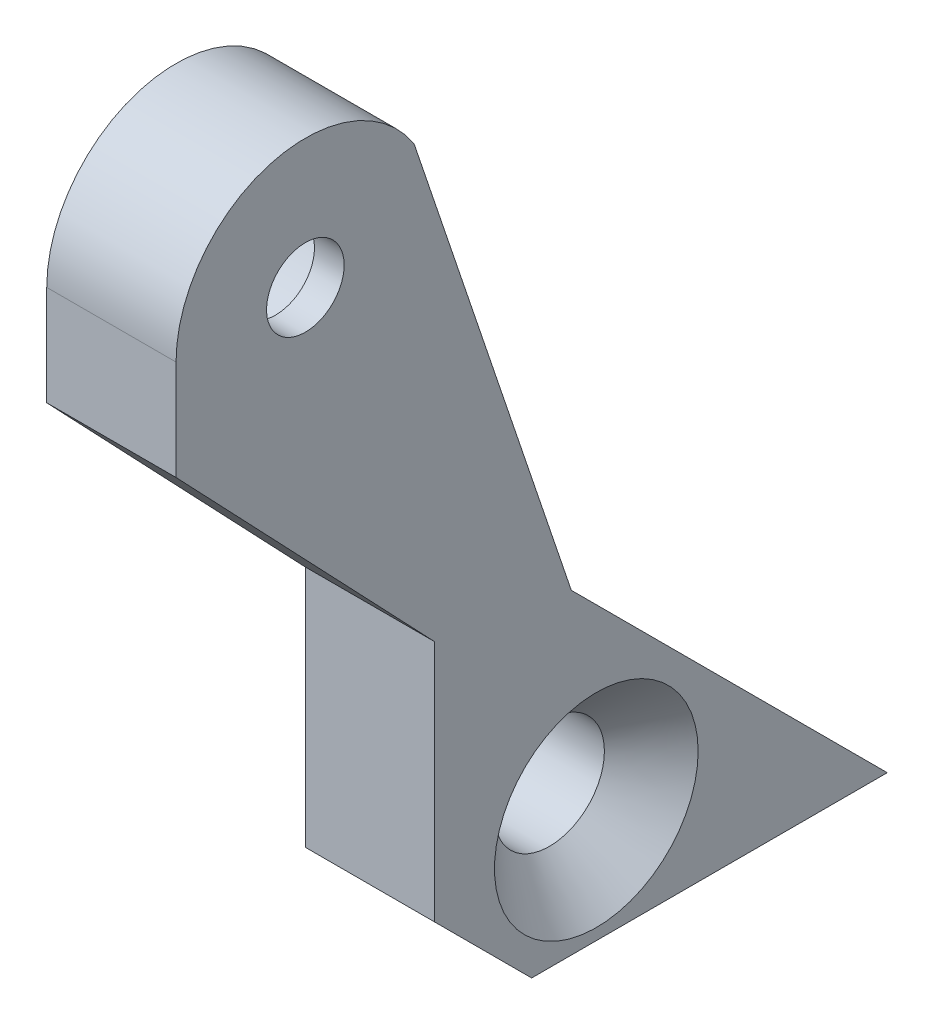
ISO-10303-21;
HEADER;
FILE_DESCRIPTION(('STEP AP214'),'2;1');
FILE_NAME('part.step','',(''),(''),'','','');
FILE_SCHEMA(('AUTOMOTIVE_DESIGN { 1 0 10303 214 1 1 1 1 }'));
ENDSEC;
DATA;
#1=APPLICATION_CONTEXT('core data for automotive mechanical design processes');
#2=APPLICATION_PROTOCOL_DEFINITION('international standard','automotive_design',2000,#1);
#3=PRODUCT_CONTEXT('',#1,'mechanical');
#4=PRODUCT('Part','Part','',(#3));
#5=PRODUCT_RELATED_PRODUCT_CATEGORY('part','',(#4));
#6=PRODUCT_DEFINITION_FORMATION('','',#4);
#7=PRODUCT_DEFINITION_CONTEXT('part definition',#1,'design');
#8=PRODUCT_DEFINITION('design','',#6,#7);
#9=PRODUCT_DEFINITION_SHAPE('','',#8);
#10=(LENGTH_UNIT() NAMED_UNIT(*) SI_UNIT(.MILLI.,.METRE.));
#11=(NAMED_UNIT(*) PLANE_ANGLE_UNIT() SI_UNIT($,.RADIAN.));
#12=(NAMED_UNIT(*) SI_UNIT($,.STERADIAN.) SOLID_ANGLE_UNIT());
#13=UNCERTAINTY_MEASURE_WITH_UNIT(LENGTH_MEASURE(1.E-05),#10,'distance_accuracy_value','');
#14=(GEOMETRIC_REPRESENTATION_CONTEXT(3) GLOBAL_UNCERTAINTY_ASSIGNED_CONTEXT((#13)) GLOBAL_UNIT_ASSIGNED_CONTEXT((#10,
#11,#12)) REPRESENTATION_CONTEXT('',''));
#15=CARTESIAN_POINT('',(0.,0.,0.));
#16=DIRECTION('',(0.,0.,1.));
#17=DIRECTION('',(1.,0.,0.));
#18=AXIS2_PLACEMENT_3D('',#15,#16,#17);
#19=CARTESIAN_POINT('',(4.,0.,0.));
#20=DIRECTION('',(0.,0.689683794027428,-0.724110671276106));
#21=DIRECTION('',(0.,0.724110671276106,0.689683794027428));
#22=AXIS2_PLACEMENT_3D('',#19,#20,#21);
#23=PLANE('',#22);
#24=DIRECTION('',(0.,-0.724110671276106,-0.689683794027428));
#25=VECTOR('',#24,1.);
#26=CARTESIAN_POINT('',(0.,0.,0.));
#27=LINE('',#26,#25);
#28=CARTESIAN_POINT('',(0.,0.,0.));
#29=VERTEX_POINT('',#28);
#30=CARTESIAN_POINT('',(0.,-8.39933520313872,-8.));
#31=VERTEX_POINT('',#30);
#32=EDGE_CURVE('E134',#29,#31,#27,.T.);
#33=ORIENTED_EDGE('',*,*,#32,.T.);
#34=DIRECTION('',(-1.,0.,0.));
#35=VECTOR('',#34,1.);
#36=CARTESIAN_POINT('',(4.,-8.39933520313872,-8.));
#37=LINE('',#36,#35);
#38=CARTESIAN_POINT('',(4.,-8.39933520313872,-8.));
#39=VERTEX_POINT('',#38);
#40=EDGE_CURVE('E11',#39,#31,#37,.T.);
#41=ORIENTED_EDGE('',*,*,#40,.F.);
#42=DIRECTION('',(0.,-0.724110671276106,-0.689683794027428));
#43=VECTOR('',#42,1.);
#44=CARTESIAN_POINT('',(4.,0.,0.));
#45=LINE('',#44,#43);
#46=CARTESIAN_POINT('',(4.,0.,0.));
#47=VERTEX_POINT('',#46);
#48=EDGE_CURVE('E149',#47,#39,#45,.T.);
#49=ORIENTED_EDGE('',*,*,#48,.F.);
#50=DIRECTION('',(-1.,0.,0.));
#51=VECTOR('',#50,1.);
#52=CARTESIAN_POINT('',(4.,0.,0.));
#53=LINE('',#52,#51);
#54=EDGE_CURVE('E130',#47,#29,#53,.T.);
#55=ORIENTED_EDGE('',*,*,#54,.T.);
#56=EDGE_LOOP('',(#33,#41,#49,#55));
#57=FACE_BOUND('',#56,.T.);
#58=ADVANCED_FACE('F37',(#57),#23,.F.);
#59=CARTESIAN_POINT('',(4.,-8.39933520313872,-8.));
#60=DIRECTION('',(0.,0.,-1.));
#61=DIRECTION('',(-1.,0.,0.));
#62=AXIS2_PLACEMENT_3D('',#59,#60,#61);
#63=PLANE('',#62);
#64=DIRECTION('',(0.,-1.,0.));
#65=VECTOR('',#64,1.);
#66=CARTESIAN_POINT('',(0.,-8.39933520313872,-8.));
#67=LINE('',#66,#65);
#68=CARTESIAN_POINT('',(0.,-15.9081605006336,-8.));
#69=VERTEX_POINT('',#68);
#70=EDGE_CURVE('E137',#31,#69,#67,.T.);
#71=ORIENTED_EDGE('',*,*,#70,.T.);
#72=DIRECTION('',(-1.,0.,0.));
#73=VECTOR('',#72,1.);
#74=CARTESIAN_POINT('',(4.,-15.9081605006336,-8.));
#75=LINE('',#74,#73);
#76=CARTESIAN_POINT('',(4.,-15.9081605006336,-8.));
#77=VERTEX_POINT('',#76);
#78=EDGE_CURVE('E46',#77,#69,#75,.T.);
#79=ORIENTED_EDGE('',*,*,#78,.F.);
#80=DIRECTION('',(0.,-1.,0.));
#81=VECTOR('',#80,1.);
#82=CARTESIAN_POINT('',(4.,-8.39933520313872,-8.));
#83=LINE('',#82,#81);
#84=EDGE_CURVE('E97',#39,#77,#83,.T.);
#85=ORIENTED_EDGE('',*,*,#84,.F.);
#86=ORIENTED_EDGE('',*,*,#40,.T.);
#87=EDGE_LOOP('',(#71,#79,#85,#86));
#88=FACE_BOUND('',#87,.T.);
#89=ADVANCED_FACE('F236',(#88),#63,.F.);
#90=CARTESIAN_POINT('',(4.,-15.9081605006336,-8.));
#91=DIRECTION('',(0.,0.707106781186547,-0.707106781186547));
#92=DIRECTION('',(0.,0.707106781186548,0.707106781186548));
#93=AXIS2_PLACEMENT_3D('',#90,#91,#92);
#94=PLANE('',#93);
#95=DIRECTION('',(0.,-0.707106781186548,-0.707106781186548));
#96=VECTOR('',#95,1.);
#97=CARTESIAN_POINT('',(0.,-15.9081605006336,-8.));
#98=LINE('',#97,#96);
#99=CARTESIAN_POINT('',(0.,-18.9081605006336,-11.));
#100=VERTEX_POINT('',#99);
#101=EDGE_CURVE('E140',#69,#100,#98,.T.);
#102=ORIENTED_EDGE('',*,*,#101,.T.);
#103=DIRECTION('',(-1.,0.,0.));
#104=VECTOR('',#103,1.);
#105=CARTESIAN_POINT('',(4.,-18.9081605006336,-11.));
#106=LINE('',#105,#104);
#107=CARTESIAN_POINT('',(4.,-18.9081605006336,-11.));
#108=VERTEX_POINT('',#107);
#109=EDGE_CURVE('E156',#108,#100,#106,.T.);
#110=ORIENTED_EDGE('',*,*,#109,.F.);
#111=DIRECTION('',(0.,-0.707106781186548,-0.707106781186548));
#112=VECTOR('',#111,1.);
#113=CARTESIAN_POINT('',(4.,-15.9081605006336,-8.));
#114=LINE('',#113,#112);
#115=EDGE_CURVE('E165',#77,#108,#114,.T.);
#116=ORIENTED_EDGE('',*,*,#115,.F.);
#117=ORIENTED_EDGE('',*,*,#78,.T.);
#118=EDGE_LOOP('',(#102,#110,#116,#117));
#119=FACE_BOUND('',#118,.T.);
#120=ADVANCED_FACE('F163',(#119),#94,.F.);
#121=CARTESIAN_POINT('',(4.,-18.9081605006336,-11.));
#122=DIRECTION('',(0.,1.,0.));
#123=DIRECTION('',(0.,0.,1.));
#124=AXIS2_PLACEMENT_3D('',#121,#122,#123);
#125=PLANE('',#124);
#126=DIRECTION('',(0.,0.,-1.));
#127=VECTOR('',#126,1.);
#128=CARTESIAN_POINT('',(0.,-18.9081605006336,-11.));
#129=LINE('',#128,#127);
#130=CARTESIAN_POINT('',(0.,-18.9081605006336,-22.));
#131=VERTEX_POINT('',#130);
#132=EDGE_CURVE('E142',#100,#131,#129,.T.);
#133=ORIENTED_EDGE('',*,*,#132,.T.);
#134=DIRECTION('',(-1.,0.,0.));
#135=VECTOR('',#134,1.);
#136=CARTESIAN_POINT('',(4.,-18.9081605006336,-22.));
#137=LINE('',#136,#135);
#138=CARTESIAN_POINT('',(4.,-18.9081605006336,-22.));
#139=VERTEX_POINT('',#138);
#140=EDGE_CURVE('E153',#139,#131,#137,.T.);
#141=ORIENTED_EDGE('',*,*,#140,.F.);
#142=DIRECTION('',(0.,0.,-1.));
#143=VECTOR('',#142,1.);
#144=CARTESIAN_POINT('',(4.,-18.9081605006336,-11.));
#145=LINE('',#144,#143);
#146=EDGE_CURVE('E177',#108,#139,#145,.T.);
#147=ORIENTED_EDGE('',*,*,#146,.F.);
#148=ORIENTED_EDGE('',*,*,#109,.T.);
#149=EDGE_LOOP('',(#133,#141,#147,#148));
#150=FACE_BOUND('',#149,.T.);
#151=ADVANCED_FACE('F173',(#150),#125,.F.);
#152=CARTESIAN_POINT('',(4.,-18.9081605006336,-22.));
#153=DIRECTION('',(0.,-0.707106781186543,0.707106781186552));
#154=DIRECTION('',(0.,-0.707106781186552,-0.707106781186543));
#155=AXIS2_PLACEMENT_3D('',#152,#153,#154);
#156=PLANE('',#155);
#157=DIRECTION('',(0.,0.707106781186552,0.707106781186543));
#158=VECTOR('',#157,1.);
#159=CARTESIAN_POINT('',(0.,-18.9081605006336,-22.));
#160=LINE('',#159,#158);
#161=CARTESIAN_POINT('',(0.,-9.1341449956632,-12.2259844950297));
#162=VERTEX_POINT('',#161);
#163=EDGE_CURVE('E144',#131,#162,#160,.T.);
#164=ORIENTED_EDGE('',*,*,#163,.T.);
#165=DIRECTION('',(-1.,0.,0.));
#166=VECTOR('',#165,1.);
#167=CARTESIAN_POINT('',(4.,-9.1341449956632,-12.2259844950297));
#168=LINE('',#167,#166);
#169=CARTESIAN_POINT('',(4.,-9.1341449956632,-12.2259844950297));
#170=VERTEX_POINT('',#169);
#171=EDGE_CURVE('E125',#170,#162,#168,.T.);
#172=ORIENTED_EDGE('',*,*,#171,.F.);
#173=DIRECTION('',(0.,0.707106781186552,0.707106781186543));
#174=VECTOR('',#173,1.);
#175=CARTESIAN_POINT('',(4.,-18.9081605006336,-22.));
#176=LINE('',#175,#174);
#177=EDGE_CURVE('E116',#139,#170,#176,.T.);
#178=ORIENTED_EDGE('',*,*,#177,.F.);
#179=ORIENTED_EDGE('',*,*,#140,.T.);
#180=EDGE_LOOP('',(#164,#172,#178,#179));
#181=FACE_BOUND('',#180,.T.);
#182=ADVANCED_FACE('F176',(#181),#156,.F.);
#183=CARTESIAN_POINT('',(4.,5.25913739827213,-7.36196665917416));
#184=DIRECTION('',(0.,-0.320149998227886,0.947366865915567));
#185=DIRECTION('',(0.,-0.947366865915567,-0.320149998227886));
#186=AXIS2_PLACEMENT_3D('',#183,#184,#185);
#187=PLANE('',#186);
#188=DIRECTION('',(0.,0.947366865915567,0.320149998227886));
#189=VECTOR('',#188,1.);
#190=CARTESIAN_POINT('',(0.,5.25913739827213,-7.36196665917416));
#191=LINE('',#190,#189);
#192=CARTESIAN_POINT('',(0.,5.25913739827213,-7.36196665917416));
#193=VERTEX_POINT('',#192);
#194=EDGE_CURVE('E124',#162,#193,#191,.T.);
#195=ORIENTED_EDGE('',*,*,#194,.T.);
#196=DIRECTION('',(-1.,0.,0.));
#197=VECTOR('',#196,1.);
#198=CARTESIAN_POINT('',(4.,5.25913739827213,-7.36196665917416));
#199=LINE('',#198,#197);
#200=CARTESIAN_POINT('',(4.,5.25913739827213,-7.36196665917416));
#201=VERTEX_POINT('',#200);
#202=EDGE_CURVE('E121',#201,#193,#199,.T.);
#203=ORIENTED_EDGE('',*,*,#202,.F.);
#204=DIRECTION('',(0.,0.947366865915567,0.320149998227886));
#205=VECTOR('',#204,1.);
#206=CARTESIAN_POINT('',(4.,5.25913739827213,-7.36196665917416));
#207=LINE('',#206,#205);
#208=EDGE_CURVE('E110',#170,#201,#207,.T.);
#209=ORIENTED_EDGE('',*,*,#208,.F.);
#210=ORIENTED_EDGE('',*,*,#171,.T.);
#211=EDGE_LOOP('',(#195,#203,#209,#210));
#212=FACE_BOUND('',#211,.T.);
#213=ADVANCED_FACE('F122',(#212),#187,.F.);
#214=CARTESIAN_POINT('',(4.,3.09183949936636,-4.));
#215=DIRECTION('',(-1.,0.,0.));
#216=DIRECTION('',(0.,0.,1.));
#217=AXIS2_PLACEMENT_3D('',#214,#215,#216);
#218=CYLINDRICAL_SURFACE('',#217,4.);
#219=CARTESIAN_POINT('',(0.,3.09183949936636,-4.));
#220=DIRECTION('',(1.,0.,0.));
#221=DIRECTION('',(0.,0.,1.));
#222=AXIS2_PLACEMENT_3D('',#219,#220,#221);
#223=CIRCLE('',#222,4.);
#224=CARTESIAN_POINT('',(0.,3.09183949936636,0.));
#225=VERTEX_POINT('',#224);
#226=EDGE_CURVE('E83',#193,#225,#223,.T.);
#227=ORIENTED_EDGE('',*,*,#226,.T.);
#228=DIRECTION('',(-1.,0.,0.));
#229=VECTOR('',#228,1.);
#230=CARTESIAN_POINT('',(4.,3.09183949936636,0.));
#231=LINE('',#230,#229);
#232=CARTESIAN_POINT('',(4.,3.09183949936636,0.));
#233=VERTEX_POINT('',#232);
#234=EDGE_CURVE('E126',#233,#225,#231,.T.);
#235=ORIENTED_EDGE('',*,*,#234,.F.);
#236=CARTESIAN_POINT('',(4.,3.09183949936636,-4.));
#237=DIRECTION('',(1.,0.,0.));
#238=DIRECTION('',(0.,0.,1.));
#239=AXIS2_PLACEMENT_3D('',#236,#237,#238);
#240=CIRCLE('',#239,4.);
#241=EDGE_CURVE('E114',#201,#233,#240,.T.);
#242=ORIENTED_EDGE('',*,*,#241,.F.);
#243=ORIENTED_EDGE('',*,*,#202,.T.);
#244=EDGE_LOOP('',(#227,#235,#242,#243));
#245=FACE_BOUND('',#244,.T.);
#246=ADVANCED_FACE('F128',(#245),#218,.T.);
#247=CARTESIAN_POINT('',(4.,0.,0.));
#248=DIRECTION('',(0.,0.,-1.));
#249=DIRECTION('',(-1.,0.,0.));
#250=AXIS2_PLACEMENT_3D('',#247,#248,#249);
#251=PLANE('',#250);
#252=DIRECTION('',(0.,-1.,0.));
#253=VECTOR('',#252,1.);
#254=CARTESIAN_POINT('',(0.,0.,0.));
#255=LINE('',#254,#253);
#256=EDGE_CURVE('E89',#225,#29,#255,.T.);
#257=ORIENTED_EDGE('',*,*,#256,.T.);
#258=ORIENTED_EDGE('',*,*,#54,.F.);
#259=DIRECTION('',(0.,-1.,0.));
#260=VECTOR('',#259,1.);
#261=CARTESIAN_POINT('',(4.,0.,0.));
#262=LINE('',#261,#260);
#263=EDGE_CURVE('E54',#233,#47,#262,.T.);
#264=ORIENTED_EDGE('',*,*,#263,.F.);
#265=ORIENTED_EDGE('',*,*,#234,.T.);
#266=EDGE_LOOP('',(#257,#258,#264,#265));
#267=FACE_BOUND('',#266,.T.);
#268=ADVANCED_FACE('F205',(#267),#251,.F.);
#269=CARTESIAN_POINT('',(4.,3.09183949936636,-4.));
#270=DIRECTION('',(-1.,0.,0.));
#271=DIRECTION('',(0.,0.,1.));
#272=AXIS2_PLACEMENT_3D('',#269,#270,#271);
#273=PLANE('',#272);
#274=CARTESIAN_POINT('',(4.,-15.4081605006336,-13.));
#275=DIRECTION('',(1.,0.,0.));
#276=DIRECTION('',(0.,0.,-1.));
#277=AXIS2_PLACEMENT_3D('',#274,#275,#276);
#278=CIRCLE('',#277,3.15);
#279=CARTESIAN_POINT('',(4.,-15.4081605006336,-16.15));
#280=VERTEX_POINT('',#279);
#281=EDGE_CURVE('E197',#280,#280,#278,.T.);
#282=ORIENTED_EDGE('',*,*,#281,.F.);
#283=EDGE_LOOP('',(#282));
#284=FACE_BOUND('',#283,.T.);
#285=CARTESIAN_POINT('',(4.,3.09183949936636,-4.));
#286=DIRECTION('',(1.,0.,0.));
#287=DIRECTION('',(0.,0.,-1.));
#288=AXIS2_PLACEMENT_3D('',#285,#286,#287);
#289=CIRCLE('',#288,1.2);
#290=CARTESIAN_POINT('',(4.,3.09183949936636,-5.2));
#291=VERTEX_POINT('',#290);
#292=EDGE_CURVE('E188',#291,#291,#289,.T.);
#293=ORIENTED_EDGE('',*,*,#292,.F.);
#294=EDGE_LOOP('',(#293));
#295=FACE_BOUND('',#294,.T.);
#296=ORIENTED_EDGE('',*,*,#48,.T.);
#297=ORIENTED_EDGE('',*,*,#84,.T.);
#298=ORIENTED_EDGE('',*,*,#115,.T.);
#299=ORIENTED_EDGE('',*,*,#146,.T.);
#300=ORIENTED_EDGE('',*,*,#177,.T.);
#301=ORIENTED_EDGE('',*,*,#208,.T.);
#302=ORIENTED_EDGE('',*,*,#241,.T.);
#303=ORIENTED_EDGE('',*,*,#263,.T.);
#304=EDGE_LOOP('',(#296,#297,#298,#299,#300,#301,#302,#303));
#305=FACE_BOUND('',#304,.T.);
#306=ADVANCED_FACE('F112',(#284,#295,#305),#273,.F.);
#307=CARTESIAN_POINT('',(0.,3.09183949936636,-4.));
#308=DIRECTION('',(-1.,0.,0.));
#309=DIRECTION('',(0.,0.,1.));
#310=AXIS2_PLACEMENT_3D('',#307,#308,#309);
#311=PLANE('',#310);
#312=CARTESIAN_POINT('',(0.,-15.4081605006336,-13.));
#313=DIRECTION('',(1.,0.,0.));
#314=DIRECTION('',(0.,0.,-1.));
#315=AXIS2_PLACEMENT_3D('',#312,#313,#314);
#316=CIRCLE('',#315,1.7);
#317=CARTESIAN_POINT('',(0.,-15.4081605006336,-14.7));
#318=VERTEX_POINT('',#317);
#319=EDGE_CURVE('E191',#318,#318,#316,.T.);
#320=ORIENTED_EDGE('',*,*,#319,.T.);
#321=EDGE_LOOP('',(#320));
#322=FACE_BOUND('',#321,.T.);
#323=CARTESIAN_POINT('',(0.,3.09183949936636,-4.));
#324=DIRECTION('',(-1.,0.,0.));
#325=DIRECTION('',(0.,0.,1.));
#326=AXIS2_PLACEMENT_3D('',#323,#324,#325);
#327=CIRCLE('',#326,2.99999999999999);
#328=CARTESIAN_POINT('',(0.,3.09183949936636,-1.00000000000001));
#329=VERTEX_POINT('',#328);
#330=EDGE_CURVE('E185',#329,#329,#327,.T.);
#331=ORIENTED_EDGE('',*,*,#330,.F.);
#332=EDGE_LOOP('',(#331));
#333=FACE_BOUND('',#332,.T.);
#334=ORIENTED_EDGE('',*,*,#32,.F.);
#335=ORIENTED_EDGE('',*,*,#256,.F.);
#336=ORIENTED_EDGE('',*,*,#226,.F.);
#337=ORIENTED_EDGE('',*,*,#194,.F.);
#338=ORIENTED_EDGE('',*,*,#163,.F.);
#339=ORIENTED_EDGE('',*,*,#132,.F.);
#340=ORIENTED_EDGE('',*,*,#101,.F.);
#341=ORIENTED_EDGE('',*,*,#70,.F.);
#342=EDGE_LOOP('',(#334,#335,#336,#337,#338,#339,#340,#341));
#343=FACE_BOUND('',#342,.T.);
#344=ADVANCED_FACE('F169',(#322,#333,#343),#311,.T.);
#345=CARTESIAN_POINT('',(2.,3.09183949936636,-4.));
#346=DIRECTION('',(-1.,0.,0.));
#347=DIRECTION('',(0.,0.,1.));
#348=AXIS2_PLACEMENT_3D('',#345,#346,#347);
#349=CONICAL_SURFACE('',#348,2.99999999999999,1.02974425867665);
#350=CARTESIAN_POINT('',(3.08154911424961,3.09183949936636,-4.));
#351=DIRECTION('',(-1.,0.,0.));
#352=DIRECTION('',(0.,0.,1.));
#353=AXIS2_PLACEMENT_3D('',#350,#351,#352);
#354=CIRCLE('',#353,1.2);
#355=CARTESIAN_POINT('',(3.08154911424961,3.09183949936636,-2.8));
#356=VERTEX_POINT('',#355);
#357=EDGE_CURVE('E40',#356,#356,#354,.F.);
#358=ORIENTED_EDGE('',*,*,#357,.T.);
#359=EDGE_LOOP('',(#358));
#360=FACE_BOUND('',#359,.T.);
#361=CARTESIAN_POINT('',(2.,3.09183949936636,-4.));
#362=DIRECTION('',(-1.,0.,0.));
#363=DIRECTION('',(0.,0.,1.));
#364=AXIS2_PLACEMENT_3D('',#361,#362,#363);
#365=CIRCLE('',#364,2.99999999999999);
#366=CARTESIAN_POINT('',(2.,3.09183949936636,-1.00000000000001));
#367=VERTEX_POINT('',#366);
#368=EDGE_CURVE('E138',#367,#367,#365,.T.);
#369=ORIENTED_EDGE('',*,*,#368,.T.);
#370=EDGE_LOOP('',(#369));
#371=FACE_BOUND('',#370,.T.);
#372=ADVANCED_FACE('F218',(#360,#371),#349,.F.);
#373=CARTESIAN_POINT('',(0.,3.09183949936636,-4.));
#374=DIRECTION('',(-1.,0.,0.));
#375=DIRECTION('',(0.,0.,1.));
#376=AXIS2_PLACEMENT_3D('',#373,#374,#375);
#377=CYLINDRICAL_SURFACE('',#376,2.99999999999999);
#378=ORIENTED_EDGE('',*,*,#368,.F.);
#379=EDGE_LOOP('',(#378));
#380=FACE_BOUND('',#379,.T.);
#381=ORIENTED_EDGE('',*,*,#330,.T.);
#382=EDGE_LOOP('',(#381));
#383=FACE_BOUND('',#382,.T.);
#384=ADVANCED_FACE('F213',(#380,#383),#377,.F.);
#385=CARTESIAN_POINT('',(0.,3.09183949936636,-4.));
#386=DIRECTION('',(1.,0.,0.));
#387=DIRECTION('',(0.,0.,-1.));
#388=AXIS2_PLACEMENT_3D('',#385,#386,#387);
#389=CYLINDRICAL_SURFACE('',#388,1.2);
#390=ORIENTED_EDGE('',*,*,#292,.T.);
#391=EDGE_LOOP('',(#390));
#392=FACE_BOUND('',#391,.T.);
#393=ORIENTED_EDGE('',*,*,#357,.F.);
#394=EDGE_LOOP('',(#393));
#395=FACE_BOUND('',#394,.T.);
#396=ADVANCED_FACE('F209',(#392,#395),#389,.F.);
#397=CARTESIAN_POINT('',(4.,-15.4081605006336,-13.));
#398=DIRECTION('',(1.,0.,0.));
#399=DIRECTION('',(0.,0.,-1.));
#400=AXIS2_PLACEMENT_3D('',#397,#398,#399);
#401=CYLINDRICAL_SURFACE('',#400,1.7);
#402=ORIENTED_EDGE('',*,*,#319,.F.);
#403=EDGE_LOOP('',(#402));
#404=FACE_BOUND('',#403,.T.);
#405=CARTESIAN_POINT('',(2.55,-15.4081605006336,-13.));
#406=DIRECTION('',(1.,0.,0.));
#407=DIRECTION('',(0.,0.,-1.));
#408=AXIS2_PLACEMENT_3D('',#405,#406,#407);
#409=CIRCLE('',#408,1.7);
#410=CARTESIAN_POINT('',(2.55,-15.4081605006336,-14.7));
#411=VERTEX_POINT('',#410);
#412=EDGE_CURVE('E194',#411,#411,#409,.T.);
#413=ORIENTED_EDGE('',*,*,#412,.T.);
#414=EDGE_LOOP('',(#413));
#415=FACE_BOUND('',#414,.T.);
#416=ADVANCED_FACE('F212',(#404,#415),#401,.F.);
#417=CARTESIAN_POINT('',(4.,-15.4081605006336,-13.));
#418=DIRECTION('',(1.,0.,0.));
#419=DIRECTION('',(0.,0.,-1.));
#420=AXIS2_PLACEMENT_3D('',#417,#418,#419);
#421=CONICAL_SURFACE('',#420,3.15,0.785398163397449);
#422=ORIENTED_EDGE('',*,*,#412,.F.);
#423=EDGE_LOOP('',(#422));
#424=FACE_BOUND('',#423,.T.);
#425=ORIENTED_EDGE('',*,*,#281,.T.);
#426=EDGE_LOOP('',(#425));
#427=FACE_BOUND('',#426,.T.);
#428=ADVANCED_FACE('F201',(#424,#427),#421,.F.);
#429=CLOSED_SHELL('',(#58,#89,#120,#151,#182,#213,#246,#268,#306,#344,#372,#384,#396,#416,#428));
#430=MANIFOLD_SOLID_BREP('B2',#429);
#431=ADVANCED_BREP_SHAPE_REPRESENTATION('',(#18,#430),#14);
#432=SHAPE_DEFINITION_REPRESENTATION(#9,#431);
ENDSEC;
END-ISO-10303-21;
